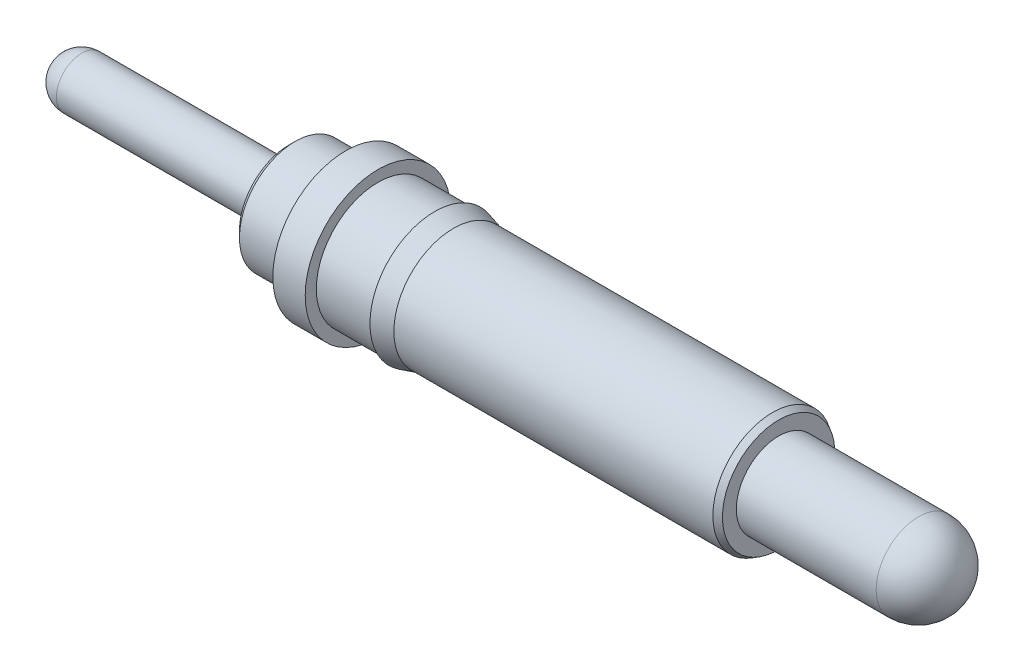
ISO-10303-21;
HEADER;
FILE_DESCRIPTION(('STEP AP214'),'2;1');
FILE_NAME('part.step','',(''),(''),'','','');
FILE_SCHEMA(('AUTOMOTIVE_DESIGN { 1 0 10303 214 1 1 1 1 }'));
ENDSEC;
DATA;
#1=APPLICATION_CONTEXT('core data for automotive mechanical design processes');
#2=APPLICATION_PROTOCOL_DEFINITION('international standard','automotive_design',2000,#1);
#3=PRODUCT_CONTEXT('',#1,'mechanical');
#4=PRODUCT('Part','Part','',(#3));
#5=PRODUCT_RELATED_PRODUCT_CATEGORY('part','',(#4));
#6=PRODUCT_DEFINITION_FORMATION('','',#4);
#7=PRODUCT_DEFINITION_CONTEXT('part definition',#1,'design');
#8=PRODUCT_DEFINITION('design','',#6,#7);
#9=PRODUCT_DEFINITION_SHAPE('','',#8);
#10=(LENGTH_UNIT() NAMED_UNIT(*) SI_UNIT(.MILLI.,.METRE.));
#11=(NAMED_UNIT(*) PLANE_ANGLE_UNIT() SI_UNIT($,.RADIAN.));
#12=(NAMED_UNIT(*) SI_UNIT($,.STERADIAN.) SOLID_ANGLE_UNIT());
#13=UNCERTAINTY_MEASURE_WITH_UNIT(LENGTH_MEASURE(1.E-05),#10,'distance_accuracy_value','');
#14=(GEOMETRIC_REPRESENTATION_CONTEXT(3) GLOBAL_UNCERTAINTY_ASSIGNED_CONTEXT((#13)) GLOBAL_UNIT_ASSIGNED_CONTEXT((#10,
#11,#12)) REPRESENTATION_CONTEXT('',''));
#15=CARTESIAN_POINT('',(0.,0.,0.));
#16=DIRECTION('',(0.,0.,1.));
#17=DIRECTION('',(1.,0.,0.));
#18=AXIS2_PLACEMENT_3D('',#15,#16,#17);
#19=CARTESIAN_POINT('',(0.317499999999853,1.69894480428479E-13,0.));
#20=DIRECTION('',(-1.,0.,0.));
#21=DIRECTION('',(0.,1.,0.));
#22=AXIS2_PLACEMENT_3D('',#19,#20,#21);
#23=SPHERICAL_SURFACE('',#22,0.317499999999853);
#24=CARTESIAN_POINT('',(0.317499999999853,0.,0.));
#25=DIRECTION('',(-1.,0.,0.));
#26=DIRECTION('',(0.,0.,1.));
#27=AXIS2_PLACEMENT_3D('',#24,#25,#26);
#28=CIRCLE('',#27,0.317500000000023);
#29=CARTESIAN_POINT('',(0.317499999999853,0.,0.317500000000023));
#30=VERTEX_POINT('',#29);
#31=EDGE_CURVE('E82',#30,#30,#28,.T.);
#32=ORIENTED_EDGE('',*,*,#31,.T.);
#33=EDGE_LOOP('',(#32));
#34=FACE_BOUND('',#33,.T.);
#35=ADVANCED_FACE('F33',(#34),#23,.T.);
#36=CARTESIAN_POINT('',(10.8229400000002,0.,0.));
#37=DIRECTION('',(-1.,0.,0.));
#38=DIRECTION('',(0.,1.,0.));
#39=AXIS2_PLACEMENT_3D('',#36,#37,#38);
#40=SPHERICAL_SURFACE('',#39,0.530859999999887);
#41=CARTESIAN_POINT('',(10.8229400000002,0.,0.));
#42=DIRECTION('',(-1.,0.,0.));
#43=DIRECTION('',(0.,0.,1.));
#44=AXIS2_PLACEMENT_3D('',#41,#42,#43);
#45=CIRCLE('',#44,0.530859999999887);
#46=CARTESIAN_POINT('',(10.8229400000002,0.,0.530859999999887));
#47=VERTEX_POINT('',#46);
#48=EDGE_CURVE('E10',#47,#47,#45,.T.);
#49=ORIENTED_EDGE('',*,*,#48,.F.);
#50=EDGE_LOOP('',(#49));
#51=FACE_BOUND('',#50,.T.);
#52=ADVANCED_FACE('F166',(#51),#40,.T.);
#53=CARTESIAN_POINT('',(0.,0.,0.));
#54=DIRECTION('',(-1.,0.,0.));
#55=DIRECTION('',(0.,0.,1.));
#56=AXIS2_PLACEMENT_3D('',#53,#54,#55);
#57=CYLINDRICAL_SURFACE('',#56,0.530859999999887);
#58=CARTESIAN_POINT('',(9.0678000000001,0.,0.));
#59=DIRECTION('',(-1.,0.,0.));
#60=DIRECTION('',(0.,0.,1.));
#61=AXIS2_PLACEMENT_3D('',#58,#59,#60);
#62=CIRCLE('',#61,0.530859999999887);
#63=CARTESIAN_POINT('',(9.0678000000001,0.,0.530859999999887));
#64=VERTEX_POINT('',#63);
#65=EDGE_CURVE('E39',#64,#64,#62,.T.);
#66=ORIENTED_EDGE('',*,*,#65,.F.);
#67=EDGE_LOOP('',(#66));
#68=FACE_BOUND('',#67,.T.);
#69=ORIENTED_EDGE('',*,*,#48,.T.);
#70=EDGE_LOOP('',(#69));
#71=FACE_BOUND('',#70,.T.);
#72=ADVANCED_FACE('F161',(#68,#71),#57,.T.);
#73=CARTESIAN_POINT('',(9.0678000000001,0.705305909487751,0.));
#74=DIRECTION('',(-1.,0.,0.));
#75=DIRECTION('',(0.,0.,1.));
#76=AXIS2_PLACEMENT_3D('',#73,#74,#75);
#77=PLANE('',#76);
#78=CARTESIAN_POINT('',(9.0678000000001,0.,0.));
#79=DIRECTION('',(-1.,0.,0.));
#80=DIRECTION('',(0.,0.,1.));
#81=AXIS2_PLACEMENT_3D('',#78,#79,#80);
#82=CIRCLE('',#81,0.705305909487751);
#83=CARTESIAN_POINT('',(9.0678000000001,0.,0.705305909487751));
#84=VERTEX_POINT('',#83);
#85=EDGE_CURVE('E43',#84,#84,#82,.T.);
#86=ORIENTED_EDGE('',*,*,#85,.F.);
#87=EDGE_LOOP('',(#86));
#88=FACE_BOUND('',#87,.T.);
#89=ORIENTED_EDGE('',*,*,#65,.T.);
#90=EDGE_LOOP('',(#89));
#91=FACE_BOUND('',#90,.T.);
#92=ADVANCED_FACE('F156',(#88,#91),#77,.F.);
#93=CARTESIAN_POINT('',(9.0678000000001,0.,0.));
#94=DIRECTION('',(-1.,0.,0.));
#95=DIRECTION('',(0.,0.,1.));
#96=AXIS2_PLACEMENT_3D('',#93,#94,#95);
#97=CONICAL_SURFACE('',#96,0.705305909487751,0.523598775598372);
#98=CARTESIAN_POINT('',(8.99160000000005,0.,0.));
#99=DIRECTION('',(-1.,0.,0.));
#100=DIRECTION('',(0.,0.,1.));
#101=AXIS2_PLACEMENT_3D('',#98,#99,#100);
#102=CIRCLE('',#101,0.749300000000036);
#103=CARTESIAN_POINT('',(8.99160000000005,0.,0.749300000000036));
#104=VERTEX_POINT('',#103);
#105=EDGE_CURVE('E47',#104,#104,#102,.T.);
#106=ORIENTED_EDGE('',*,*,#105,.F.);
#107=EDGE_LOOP('',(#106));
#108=FACE_BOUND('',#107,.T.);
#109=ORIENTED_EDGE('',*,*,#85,.T.);
#110=EDGE_LOOP('',(#109));
#111=FACE_BOUND('',#110,.T.);
#112=ADVANCED_FACE('F150',(#108,#111),#97,.T.);
#113=CARTESIAN_POINT('',(0.,0.,0.));
#114=DIRECTION('',(-1.,0.,0.));
#115=DIRECTION('',(0.,0.,1.));
#116=AXIS2_PLACEMENT_3D('',#113,#114,#115);
#117=CYLINDRICAL_SURFACE('',#116,0.749300000000036);
#118=CARTESIAN_POINT('',(4.98678522628056,0.,0.));
#119=DIRECTION('',(-1.,0.,0.));
#120=DIRECTION('',(0.,0.,1.));
#121=AXIS2_PLACEMENT_3D('',#118,#119,#120);
#122=CIRCLE('',#121,0.749300000000036);
#123=CARTESIAN_POINT('',(4.98678522628056,0.,0.749300000000036));
#124=VERTEX_POINT('',#123);
#125=EDGE_CURVE('E52',#124,#124,#122,.T.);
#126=ORIENTED_EDGE('',*,*,#125,.F.);
#127=EDGE_LOOP('',(#126));
#128=FACE_BOUND('',#127,.T.);
#129=ORIENTED_EDGE('',*,*,#105,.T.);
#130=EDGE_LOOP('',(#129));
#131=FACE_BOUND('',#130,.T.);
#132=ADVANCED_FACE('F144',(#128,#131),#117,.T.);
#133=CARTESIAN_POINT('',(4.98678522628056,0.,0.));
#134=DIRECTION('',(-1.,0.,0.));
#135=DIRECTION('',(0.,0.,1.));
#136=AXIS2_PLACEMENT_3D('',#133,#134,#135);
#137=CONICAL_SURFACE('',#136,0.749300000000036,0.261799387799377);
#138=CARTESIAN_POINT('',(4.74980000000002,0.,0.));
#139=DIRECTION('',(-1.,0.,0.));
#140=DIRECTION('',(0.,0.,1.));
#141=AXIS2_PLACEMENT_3D('',#138,#139,#140);
#142=CIRCLE('',#141,0.812800000000071);
#143=CARTESIAN_POINT('',(4.74980000000002,0.,0.812800000000071));
#144=VERTEX_POINT('',#143);
#145=EDGE_CURVE('E55',#144,#144,#142,.T.);
#146=ORIENTED_EDGE('',*,*,#145,.F.);
#147=EDGE_LOOP('',(#146));
#148=FACE_BOUND('',#147,.T.);
#149=ORIENTED_EDGE('',*,*,#125,.T.);
#150=EDGE_LOOP('',(#149));
#151=FACE_BOUND('',#150,.T.);
#152=ADVANCED_FACE('F138',(#148,#151),#137,.T.);
#153=CARTESIAN_POINT('',(4.74980000000002,0.774700000000045,0.));
#154=DIRECTION('',(1.,0.,0.));
#155=DIRECTION('',(0.,0.,-1.));
#156=AXIS2_PLACEMENT_3D('',#153,#154,#155);
#157=PLANE('',#156);
#158=CARTESIAN_POINT('',(4.74980000000002,0.,0.));
#159=DIRECTION('',(-1.,0.,0.));
#160=DIRECTION('',(0.,0.,1.));
#161=AXIS2_PLACEMENT_3D('',#158,#159,#160);
#162=CIRCLE('',#161,0.774700000000045);
#163=CARTESIAN_POINT('',(4.74980000000002,0.,0.774700000000045));
#164=VERTEX_POINT('',#163);
#165=EDGE_CURVE('E58',#164,#164,#162,.T.);
#166=ORIENTED_EDGE('',*,*,#165,.F.);
#167=EDGE_LOOP('',(#166));
#168=FACE_BOUND('',#167,.T.);
#169=ORIENTED_EDGE('',*,*,#145,.T.);
#170=EDGE_LOOP('',(#169));
#171=FACE_BOUND('',#170,.T.);
#172=ADVANCED_FACE('F132',(#168,#171),#157,.F.);
#173=CARTESIAN_POINT('',(0.,0.,0.));
#174=DIRECTION('',(-1.,0.,0.));
#175=DIRECTION('',(0.,0.,1.));
#176=AXIS2_PLACEMENT_3D('',#173,#174,#175);
#177=CYLINDRICAL_SURFACE('',#176,0.774700000000045);
#178=CARTESIAN_POINT('',(4.03860000000005,0.,0.));
#179=DIRECTION('',(-1.,0.,0.));
#180=DIRECTION('',(0.,0.,1.));
#181=AXIS2_PLACEMENT_3D('',#178,#179,#180);
#182=CIRCLE('',#181,0.774700000000045);
#183=CARTESIAN_POINT('',(4.03860000000005,0.,0.774700000000045));
#184=VERTEX_POINT('',#183);
#185=EDGE_CURVE('E61',#184,#184,#182,.T.);
#186=ORIENTED_EDGE('',*,*,#185,.F.);
#187=EDGE_LOOP('',(#186));
#188=FACE_BOUND('',#187,.T.);
#189=ORIENTED_EDGE('',*,*,#165,.T.);
#190=EDGE_LOOP('',(#189));
#191=FACE_BOUND('',#190,.T.);
#192=ADVANCED_FACE('F126',(#188,#191),#177,.T.);
#193=CARTESIAN_POINT('',(4.03860000000005,0.914400000000037,0.));
#194=DIRECTION('',(-1.,0.,0.));
#195=DIRECTION('',(0.,0.,1.));
#196=AXIS2_PLACEMENT_3D('',#193,#194,#195);
#197=PLANE('',#196);
#198=CARTESIAN_POINT('',(4.03860000000005,0.,0.));
#199=DIRECTION('',(-1.,0.,0.));
#200=DIRECTION('',(0.,0.,1.));
#201=AXIS2_PLACEMENT_3D('',#198,#199,#200);
#202=CIRCLE('',#201,0.914400000000037);
#203=CARTESIAN_POINT('',(4.03860000000005,0.,0.914400000000037));
#204=VERTEX_POINT('',#203);
#205=EDGE_CURVE('E64',#204,#204,#202,.T.);
#206=ORIENTED_EDGE('',*,*,#205,.F.);
#207=EDGE_LOOP('',(#206));
#208=FACE_BOUND('',#207,.T.);
#209=ORIENTED_EDGE('',*,*,#185,.T.);
#210=EDGE_LOOP('',(#209));
#211=FACE_BOUND('',#210,.T.);
#212=ADVANCED_FACE('F120',(#208,#211),#197,.F.);
#213=CARTESIAN_POINT('',(0.,0.,0.));
#214=DIRECTION('',(-1.,0.,0.));
#215=DIRECTION('',(0.,0.,1.));
#216=AXIS2_PLACEMENT_3D('',#213,#214,#215);
#217=CYLINDRICAL_SURFACE('',#216,0.914400000000037);
#218=CARTESIAN_POINT('',(3.63220000000005,0.,0.));
#219=DIRECTION('',(-1.,0.,0.));
#220=DIRECTION('',(0.,0.,1.));
#221=AXIS2_PLACEMENT_3D('',#218,#219,#220);
#222=CIRCLE('',#221,0.914400000000037);
#223=CARTESIAN_POINT('',(3.63220000000005,0.,0.914400000000037));
#224=VERTEX_POINT('',#223);
#225=EDGE_CURVE('E67',#224,#224,#222,.T.);
#226=ORIENTED_EDGE('',*,*,#225,.F.);
#227=EDGE_LOOP('',(#226));
#228=FACE_BOUND('',#227,.T.);
#229=ORIENTED_EDGE('',*,*,#205,.T.);
#230=EDGE_LOOP('',(#229));
#231=FACE_BOUND('',#230,.T.);
#232=ADVANCED_FACE('F114',(#228,#231),#217,.T.);
#233=CARTESIAN_POINT('',(3.63220000000005,0.698499999999853,0.));
#234=DIRECTION('',(1.,0.,0.));
#235=DIRECTION('',(0.,0.,-1.));
#236=AXIS2_PLACEMENT_3D('',#233,#234,#235);
#237=PLANE('',#236);
#238=CARTESIAN_POINT('',(3.63220000000005,0.,0.));
#239=DIRECTION('',(-1.,0.,0.));
#240=DIRECTION('',(0.,0.,1.));
#241=AXIS2_PLACEMENT_3D('',#238,#239,#240);
#242=CIRCLE('',#241,0.698499999999853);
#243=CARTESIAN_POINT('',(3.63220000000005,0.,0.698499999999853));
#244=VERTEX_POINT('',#243);
#245=EDGE_CURVE('E70',#244,#244,#242,.T.);
#246=ORIENTED_EDGE('',*,*,#245,.F.);
#247=EDGE_LOOP('',(#246));
#248=FACE_BOUND('',#247,.T.);
#249=ORIENTED_EDGE('',*,*,#225,.T.);
#250=EDGE_LOOP('',(#249));
#251=FACE_BOUND('',#250,.T.);
#252=ADVANCED_FACE('F108',(#248,#251),#237,.F.);
#253=CARTESIAN_POINT('',(0.,0.,0.));
#254=DIRECTION('',(-1.,0.,0.));
#255=DIRECTION('',(0.,0.,1.));
#256=AXIS2_PLACEMENT_3D('',#253,#254,#255);
#257=CYLINDRICAL_SURFACE('',#256,0.698499999999853);
#258=CARTESIAN_POINT('',(2.9971999999999,0.,0.));
#259=DIRECTION('',(-1.,0.,0.));
#260=DIRECTION('',(0.,0.,1.));
#261=AXIS2_PLACEMENT_3D('',#258,#259,#260);
#262=CIRCLE('',#261,0.698499999999853);
#263=CARTESIAN_POINT('',(2.9971999999999,0.,0.698499999999853));
#264=VERTEX_POINT('',#263);
#265=EDGE_CURVE('E73',#264,#264,#262,.T.);
#266=ORIENTED_EDGE('',*,*,#265,.F.);
#267=EDGE_LOOP('',(#266));
#268=FACE_BOUND('',#267,.T.);
#269=ORIENTED_EDGE('',*,*,#245,.T.);
#270=EDGE_LOOP('',(#269));
#271=FACE_BOUND('',#270,.T.);
#272=ADVANCED_FACE('F102',(#268,#271),#257,.T.);
#273=CARTESIAN_POINT('',(2.9971999999999,0.,0.));
#274=DIRECTION('',(1.,0.,0.));
#275=DIRECTION('',(0.,0.,-1.));
#276=AXIS2_PLACEMENT_3D('',#273,#274,#275);
#277=CONICAL_SURFACE('',#276,0.698499999999853,0.785398163397985);
#278=CARTESIAN_POINT('',(2.9210000000001,0.,0.));
#279=DIRECTION('',(-1.,0.,0.));
#280=DIRECTION('',(0.,0.,1.));
#281=AXIS2_PLACEMENT_3D('',#278,#279,#280);
#282=CIRCLE('',#281,0.622299999999966);
#283=CARTESIAN_POINT('',(2.9210000000001,0.,0.622299999999966));
#284=VERTEX_POINT('',#283);
#285=EDGE_CURVE('E76',#284,#284,#282,.T.);
#286=ORIENTED_EDGE('',*,*,#285,.F.);
#287=EDGE_LOOP('',(#286));
#288=FACE_BOUND('',#287,.T.);
#289=ORIENTED_EDGE('',*,*,#265,.T.);
#290=EDGE_LOOP('',(#289));
#291=FACE_BOUND('',#290,.T.);
#292=ADVANCED_FACE('F96',(#288,#291),#277,.T.);
#293=CARTESIAN_POINT('',(2.9210000000001,0.317500000000023,0.));
#294=DIRECTION('',(1.,0.,0.));
#295=DIRECTION('',(0.,0.,-1.));
#296=AXIS2_PLACEMENT_3D('',#293,#294,#295);
#297=PLANE('',#296);
#298=CARTESIAN_POINT('',(2.9210000000001,0.,0.));
#299=DIRECTION('',(-1.,0.,0.));
#300=DIRECTION('',(0.,0.,1.));
#301=AXIS2_PLACEMENT_3D('',#298,#299,#300);
#302=CIRCLE('',#301,0.317500000000023);
#303=CARTESIAN_POINT('',(2.9210000000001,0.,0.317500000000023));
#304=VERTEX_POINT('',#303);
#305=EDGE_CURVE('E79',#304,#304,#302,.T.);
#306=ORIENTED_EDGE('',*,*,#305,.F.);
#307=EDGE_LOOP('',(#306));
#308=FACE_BOUND('',#307,.T.);
#309=ORIENTED_EDGE('',*,*,#285,.T.);
#310=EDGE_LOOP('',(#309));
#311=FACE_BOUND('',#310,.T.);
#312=ADVANCED_FACE('F90',(#308,#311),#297,.F.);
#313=CARTESIAN_POINT('',(0.,0.,0.));
#314=DIRECTION('',(-1.,0.,0.));
#315=DIRECTION('',(0.,0.,1.));
#316=AXIS2_PLACEMENT_3D('',#313,#314,#315);
#317=CYLINDRICAL_SURFACE('',#316,0.317500000000023);
#318=ORIENTED_EDGE('',*,*,#31,.F.);
#319=EDGE_LOOP('',(#318));
#320=FACE_BOUND('',#319,.T.);
#321=ORIENTED_EDGE('',*,*,#305,.T.);
#322=EDGE_LOOP('',(#321));
#323=FACE_BOUND('',#322,.T.);
#324=ADVANCED_FACE('F87',(#320,#323),#317,.T.);
#325=CLOSED_SHELL('',(#35,#52,#72,#92,#112,#132,#152,#172,#192,#212,#232,#252,#272,#292,#312,#324));
#326=MANIFOLD_SOLID_BREP('B2',#325);
#327=ADVANCED_BREP_SHAPE_REPRESENTATION('',(#18,#326),#14);
#328=SHAPE_DEFINITION_REPRESENTATION(#9,#327);
ENDSEC;
END-ISO-10303-21;
